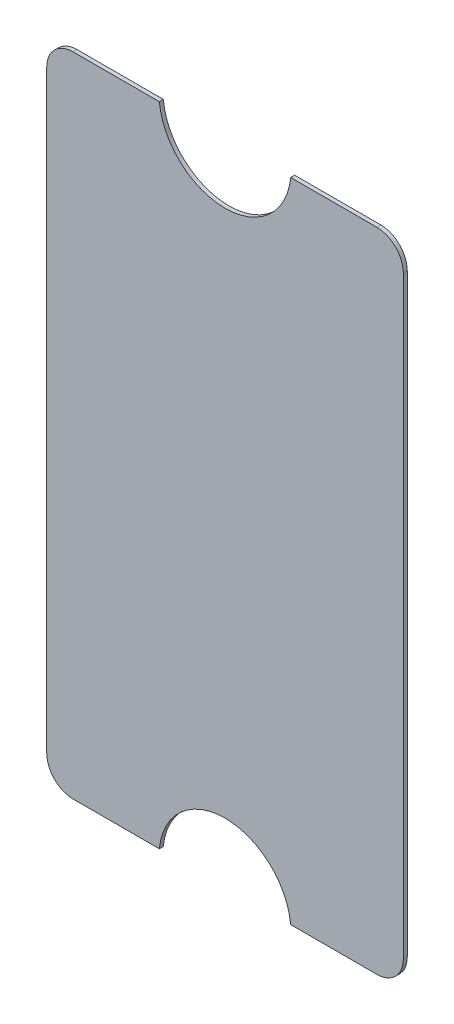
ISO-10303-21;
HEADER;
FILE_DESCRIPTION(('STEP AP214'),'2;1');
FILE_NAME('part.step','',(''),(''),'','','');
FILE_SCHEMA(('AUTOMOTIVE_DESIGN { 1 0 10303 214 1 1 1 1 }'));
ENDSEC;
DATA;
#1=APPLICATION_CONTEXT('core data for automotive mechanical design processes');
#2=APPLICATION_PROTOCOL_DEFINITION('international standard','automotive_design',2000,#1);
#3=PRODUCT_CONTEXT('',#1,'mechanical');
#4=PRODUCT('Part','Part','',(#3));
#5=PRODUCT_RELATED_PRODUCT_CATEGORY('part','',(#4));
#6=PRODUCT_DEFINITION_FORMATION('','',#4);
#7=PRODUCT_DEFINITION_CONTEXT('part definition',#1,'design');
#8=PRODUCT_DEFINITION('design','',#6,#7);
#9=PRODUCT_DEFINITION_SHAPE('','',#8);
#10=(LENGTH_UNIT() NAMED_UNIT(*) SI_UNIT(.MILLI.,.METRE.));
#11=(NAMED_UNIT(*) PLANE_ANGLE_UNIT() SI_UNIT($,.RADIAN.));
#12=(NAMED_UNIT(*) SI_UNIT($,.STERADIAN.) SOLID_ANGLE_UNIT());
#13=UNCERTAINTY_MEASURE_WITH_UNIT(LENGTH_MEASURE(1.E-05),#10,'distance_accuracy_value','');
#14=(GEOMETRIC_REPRESENTATION_CONTEXT(3) GLOBAL_UNCERTAINTY_ASSIGNED_CONTEXT((#13)) GLOBAL_UNIT_ASSIGNED_CONTEXT((#10,
#11,#12)) REPRESENTATION_CONTEXT('',''));
#15=CARTESIAN_POINT('',(0.,0.,0.));
#16=DIRECTION('',(0.,0.,1.));
#17=DIRECTION('',(1.,0.,0.));
#18=AXIS2_PLACEMENT_3D('',#15,#16,#17);
#19=CARTESIAN_POINT('',(-0.601078804943356,0.,0.3));
#20=DIRECTION('',(0.,0.,-1.));
#21=DIRECTION('',(-1.,0.,0.));
#22=AXIS2_PLACEMENT_3D('',#19,#20,#21);
#23=CYLINDRICAL_SURFACE('',#22,5.);
#24=CARTESIAN_POINT('',(-0.601078804943356,0.,0.));
#25=DIRECTION('',(0.,0.,-1.));
#26=DIRECTION('',(1.,0.,0.));
#27=AXIS2_PLACEMENT_3D('',#24,#25,#26);
#28=CIRCLE('',#27,5.);
#29=CARTESIAN_POINT('',(-5.57601599047645,0.500000000000104,0.));
#30=VERTEX_POINT('',#29);
#31=CARTESIAN_POINT('',(4.37385838058975,0.50000000000005,0.));
#32=VERTEX_POINT('',#31);
#33=EDGE_CURVE('E154',#30,#32,#28,.T.);
#34=ORIENTED_EDGE('',*,*,#33,.T.);
#35=DIRECTION('',(0.,0.,-1.));
#36=VECTOR('',#35,1.);
#37=CARTESIAN_POINT('',(4.37385838058975,0.50000000000005,0.3));
#38=LINE('',#37,#36);
#39=CARTESIAN_POINT('',(4.37385838058975,0.50000000000005,0.3));
#40=VERTEX_POINT('',#39);
#41=EDGE_CURVE('E11',#40,#32,#38,.T.);
#42=ORIENTED_EDGE('',*,*,#41,.F.);
#43=CARTESIAN_POINT('',(-0.601078804943356,0.,0.3));
#44=DIRECTION('',(0.,0.,-1.));
#45=DIRECTION('',(1.,0.,0.));
#46=AXIS2_PLACEMENT_3D('',#43,#44,#45);
#47=CIRCLE('',#46,5.);
#48=CARTESIAN_POINT('',(-5.57601599047645,0.500000000000104,0.3));
#49=VERTEX_POINT('',#48);
#50=EDGE_CURVE('E176',#49,#40,#47,.T.);
#51=ORIENTED_EDGE('',*,*,#50,.F.);
#52=DIRECTION('',(0.,0.,-1.));
#53=VECTOR('',#52,1.);
#54=CARTESIAN_POINT('',(-5.57601599047645,0.500000000000104,0.3));
#55=LINE('',#54,#53);
#56=EDGE_CURVE('E150',#49,#30,#55,.T.);
#57=ORIENTED_EDGE('',*,*,#56,.T.);
#58=EDGE_LOOP('',(#34,#42,#51,#57));
#59=FACE_BOUND('',#58,.T.);
#60=ADVANCED_FACE('F34',(#59),#23,.F.);
#61=CARTESIAN_POINT('',(4.37385838058975,0.50000000000005,0.3));
#62=DIRECTION('',(0.,1.,0.));
#63=DIRECTION('',(-1.,0.,0.));
#64=AXIS2_PLACEMENT_3D('',#61,#62,#63);
#65=PLANE('',#64);
#66=DIRECTION('',(1.,0.,0.));
#67=VECTOR('',#66,1.);
#68=CARTESIAN_POINT('',(4.37385838058975,0.50000000000005,0.));
#69=LINE('',#68,#67);
#70=CARTESIAN_POINT('',(10.8989211950564,0.500000000000014,0.));
#71=VERTEX_POINT('',#70);
#72=EDGE_CURVE('E157',#32,#71,#69,.T.);
#73=ORIENTED_EDGE('',*,*,#72,.T.);
#74=DIRECTION('',(0.,0.,-1.));
#75=VECTOR('',#74,1.);
#76=CARTESIAN_POINT('',(10.8989211950564,0.500000000000014,0.3));
#77=LINE('',#76,#75);
#78=CARTESIAN_POINT('',(10.8989211950564,0.500000000000014,0.3));
#79=VERTEX_POINT('',#78);
#80=EDGE_CURVE('E42',#79,#71,#77,.T.);
#81=ORIENTED_EDGE('',*,*,#80,.F.);
#82=DIRECTION('',(1.,0.,0.));
#83=VECTOR('',#82,1.);
#84=CARTESIAN_POINT('',(4.37385838058975,0.50000000000005,0.3));
#85=LINE('',#84,#83);
#86=EDGE_CURVE('E105',#40,#79,#85,.T.);
#87=ORIENTED_EDGE('',*,*,#86,.F.);
#88=ORIENTED_EDGE('',*,*,#41,.T.);
#89=EDGE_LOOP('',(#73,#81,#87,#88));
#90=FACE_BOUND('',#89,.T.);
#91=ADVANCED_FACE('F254',(#90),#65,.F.);
#92=CARTESIAN_POINT('',(10.8989211950564,2.50000000000001,0.3));
#93=DIRECTION('',(0.,0.,-1.));
#94=DIRECTION('',(-1.,0.,0.));
#95=AXIS2_PLACEMENT_3D('',#92,#93,#94);
#96=CYLINDRICAL_SURFACE('',#95,2.);
#97=CARTESIAN_POINT('',(10.8989211950564,2.50000000000001,0.));
#98=DIRECTION('',(0.,0.,1.));
#99=DIRECTION('',(1.,0.,0.));
#100=AXIS2_PLACEMENT_3D('',#97,#98,#99);
#101=CIRCLE('',#100,2.);
#102=CARTESIAN_POINT('',(12.8989211950564,2.50000000000001,0.));
#103=VERTEX_POINT('',#102);
#104=EDGE_CURVE('E159',#71,#103,#101,.T.);
#105=ORIENTED_EDGE('',*,*,#104,.T.);
#106=DIRECTION('',(0.,0.,-1.));
#107=VECTOR('',#106,1.);
#108=CARTESIAN_POINT('',(12.8989211950564,2.50000000000001,0.3));
#109=LINE('',#108,#107);
#110=CARTESIAN_POINT('',(12.8989211950564,2.50000000000001,0.3));
#111=VERTEX_POINT('',#110);
#112=EDGE_CURVE('E195',#111,#103,#109,.T.);
#113=ORIENTED_EDGE('',*,*,#112,.F.);
#114=CARTESIAN_POINT('',(10.8989211950564,2.50000000000001,0.3));
#115=DIRECTION('',(0.,0.,1.));
#116=DIRECTION('',(1.,0.,0.));
#117=AXIS2_PLACEMENT_3D('',#114,#115,#116);
#118=CIRCLE('',#117,2.);
#119=EDGE_CURVE('E203',#79,#111,#118,.T.);
#120=ORIENTED_EDGE('',*,*,#119,.F.);
#121=ORIENTED_EDGE('',*,*,#80,.T.);
#122=EDGE_LOOP('',(#105,#113,#120,#121));
#123=FACE_BOUND('',#122,.T.);
#124=ADVANCED_FACE('F201',(#123),#96,.T.);
#125=CARTESIAN_POINT('',(12.8989211950564,2.50000000000001,0.3));
#126=DIRECTION('',(-1.,0.,0.));
#127=DIRECTION('',(0.,-1.,0.));
#128=AXIS2_PLACEMENT_3D('',#125,#126,#127);
#129=PLANE('',#128);
#130=DIRECTION('',(0.,1.,0.));
#131=VECTOR('',#130,1.);
#132=CARTESIAN_POINT('',(12.8989211950564,2.50000000000001,0.));
#133=LINE('',#132,#131);
#134=CARTESIAN_POINT('',(12.8989211950564,47.5,0.));
#135=VERTEX_POINT('',#134);
#136=EDGE_CURVE('E161',#103,#135,#133,.T.);
#137=ORIENTED_EDGE('',*,*,#136,.T.);
#138=DIRECTION('',(0.,0.,-1.));
#139=VECTOR('',#138,1.);
#140=CARTESIAN_POINT('',(12.8989211950564,47.5,0.3));
#141=LINE('',#140,#139);
#142=CARTESIAN_POINT('',(12.8989211950564,47.5,0.3));
#143=VERTEX_POINT('',#142);
#144=EDGE_CURVE('E192',#143,#135,#141,.T.);
#145=ORIENTED_EDGE('',*,*,#144,.F.);
#146=DIRECTION('',(0.,1.,0.));
#147=VECTOR('',#146,1.);
#148=CARTESIAN_POINT('',(12.8989211950564,2.50000000000001,0.3));
#149=LINE('',#148,#147);
#150=EDGE_CURVE('E221',#111,#143,#149,.T.);
#151=ORIENTED_EDGE('',*,*,#150,.F.);
#152=ORIENTED_EDGE('',*,*,#112,.T.);
#153=EDGE_LOOP('',(#137,#145,#151,#152));
#154=FACE_BOUND('',#153,.T.);
#155=ADVANCED_FACE('F212',(#154),#129,.F.);
#156=CARTESIAN_POINT('',(10.8989211950564,47.5,0.3));
#157=DIRECTION('',(0.,0.,-1.));
#158=DIRECTION('',(-1.,0.,0.));
#159=AXIS2_PLACEMENT_3D('',#156,#157,#158);
#160=CYLINDRICAL_SURFACE('',#159,2.);
#161=CARTESIAN_POINT('',(10.8989211950564,47.5,0.));
#162=DIRECTION('',(0.,0.,1.));
#163=DIRECTION('',(1.,0.,0.));
#164=AXIS2_PLACEMENT_3D('',#161,#162,#163);
#165=CIRCLE('',#164,2.);
#166=CARTESIAN_POINT('',(10.8989211950564,49.5,0.));
#167=VERTEX_POINT('',#166);
#168=EDGE_CURVE('E163',#135,#167,#165,.T.);
#169=ORIENTED_EDGE('',*,*,#168,.T.);
#170=DIRECTION('',(0.,0.,-1.));
#171=VECTOR('',#170,1.);
#172=CARTESIAN_POINT('',(10.8989211950564,49.5,0.3));
#173=LINE('',#172,#171);
#174=CARTESIAN_POINT('',(10.8989211950564,49.5,0.3));
#175=VERTEX_POINT('',#174);
#176=EDGE_CURVE('E189',#175,#167,#173,.T.);
#177=ORIENTED_EDGE('',*,*,#176,.F.);
#178=CARTESIAN_POINT('',(10.8989211950564,47.5,0.3));
#179=DIRECTION('',(0.,0.,1.));
#180=DIRECTION('',(1.,0.,0.));
#181=AXIS2_PLACEMENT_3D('',#178,#179,#180);
#182=CIRCLE('',#181,2.);
#183=EDGE_CURVE('E218',#143,#175,#182,.T.);
#184=ORIENTED_EDGE('',*,*,#183,.F.);
#185=ORIENTED_EDGE('',*,*,#144,.T.);
#186=EDGE_LOOP('',(#169,#177,#184,#185));
#187=FACE_BOUND('',#186,.T.);
#188=ADVANCED_FACE('F216',(#187),#160,.T.);
#189=CARTESIAN_POINT('',(10.8989211950564,49.5,0.3));
#190=DIRECTION('',(0.,-1.,0.));
#191=DIRECTION('',(0.,0.,-1.));
#192=AXIS2_PLACEMENT_3D('',#189,#190,#191);
#193=PLANE('',#192);
#194=DIRECTION('',(-1.,0.,0.));
#195=VECTOR('',#194,1.);
#196=CARTESIAN_POINT('',(10.8989211950564,49.5,0.));
#197=LINE('',#196,#195);
#198=CARTESIAN_POINT('',(4.37385838058954,49.5,0.));
#199=VERTEX_POINT('',#198);
#200=EDGE_CURVE('E165',#167,#199,#197,.T.);
#201=ORIENTED_EDGE('',*,*,#200,.T.);
#202=DIRECTION('',(0.,0.,-1.));
#203=VECTOR('',#202,1.);
#204=CARTESIAN_POINT('',(4.37385838058954,49.5,0.3));
#205=LINE('',#204,#203);
#206=CARTESIAN_POINT('',(4.37385838058954,49.5,0.3));
#207=VERTEX_POINT('',#206);
#208=EDGE_CURVE('E186',#207,#199,#205,.T.);
#209=ORIENTED_EDGE('',*,*,#208,.F.);
#210=DIRECTION('',(-1.,0.,0.));
#211=VECTOR('',#210,1.);
#212=CARTESIAN_POINT('',(10.8989211950564,49.5,0.3));
#213=LINE('',#212,#211);
#214=EDGE_CURVE('E220',#175,#207,#213,.T.);
#215=ORIENTED_EDGE('',*,*,#214,.F.);
#216=ORIENTED_EDGE('',*,*,#176,.T.);
#217=EDGE_LOOP('',(#201,#209,#215,#216));
#218=FACE_BOUND('',#217,.T.);
#219=ADVANCED_FACE('F267',(#218),#193,.F.);
#220=CARTESIAN_POINT('',(-0.601078804943561,50.,0.3));
#221=DIRECTION('',(0.,0.,-1.));
#222=DIRECTION('',(-1.,0.,0.));
#223=AXIS2_PLACEMENT_3D('',#220,#221,#222);
#224=CYLINDRICAL_SURFACE('',#223,5.);
#225=CARTESIAN_POINT('',(-0.601078804943561,50.,0.));
#226=DIRECTION('',(0.,0.,-1.));
#227=DIRECTION('',(1.,0.,0.));
#228=AXIS2_PLACEMENT_3D('',#225,#226,#227);
#229=CIRCLE('',#228,5.);
#230=CARTESIAN_POINT('',(-5.57601599047666,49.5,0.));
#231=VERTEX_POINT('',#230);
#232=EDGE_CURVE('E167',#199,#231,#229,.T.);
#233=ORIENTED_EDGE('',*,*,#232,.T.);
#234=DIRECTION('',(0.,0.,-1.));
#235=VECTOR('',#234,1.);
#236=CARTESIAN_POINT('',(-5.57601599047666,49.5,0.3));
#237=LINE('',#236,#235);
#238=CARTESIAN_POINT('',(-5.57601599047666,49.5,0.3));
#239=VERTEX_POINT('',#238);
#240=EDGE_CURVE('E183',#239,#231,#237,.T.);
#241=ORIENTED_EDGE('',*,*,#240,.F.);
#242=CARTESIAN_POINT('',(-0.601078804943561,50.,0.3));
#243=DIRECTION('',(0.,0.,-1.));
#244=DIRECTION('',(1.,0.,0.));
#245=AXIS2_PLACEMENT_3D('',#242,#243,#244);
#246=CIRCLE('',#245,5.);
#247=EDGE_CURVE('E223',#207,#239,#246,.T.);
#248=ORIENTED_EDGE('',*,*,#247,.F.);
#249=ORIENTED_EDGE('',*,*,#208,.T.);
#250=EDGE_LOOP('',(#233,#241,#248,#249));
#251=FACE_BOUND('',#250,.T.);
#252=ADVANCED_FACE('F270',(#251),#224,.F.);
#253=CARTESIAN_POINT('',(-5.57601599047666,49.5,0.3));
#254=DIRECTION('',(0.,-1.,0.));
#255=DIRECTION('',(0.,0.,-1.));
#256=AXIS2_PLACEMENT_3D('',#253,#254,#255);
#257=PLANE('',#256);
#258=DIRECTION('',(-1.,0.,0.));
#259=VECTOR('',#258,1.);
#260=CARTESIAN_POINT('',(-5.57601599047666,49.5,0.));
#261=LINE('',#260,#259);
#262=CARTESIAN_POINT('',(-12.1010788049435,49.5,0.));
#263=VERTEX_POINT('',#262);
#264=EDGE_CURVE('E169',#231,#263,#261,.T.);
#265=ORIENTED_EDGE('',*,*,#264,.T.);
#266=DIRECTION('',(0.,0.,-1.));
#267=VECTOR('',#266,1.);
#268=CARTESIAN_POINT('',(-12.1010788049435,49.5,0.3));
#269=LINE('',#268,#267);
#270=CARTESIAN_POINT('',(-12.1010788049435,49.5,0.3));
#271=VERTEX_POINT('',#270);
#272=EDGE_CURVE('E180',#271,#263,#269,.T.);
#273=ORIENTED_EDGE('',*,*,#272,.F.);
#274=DIRECTION('',(-1.,0.,0.));
#275=VECTOR('',#274,1.);
#276=CARTESIAN_POINT('',(-5.57601599047666,49.5,0.3));
#277=LINE('',#276,#275);
#278=EDGE_CURVE('E229',#239,#271,#277,.T.);
#279=ORIENTED_EDGE('',*,*,#278,.F.);
#280=ORIENTED_EDGE('',*,*,#240,.T.);
#281=EDGE_LOOP('',(#265,#273,#279,#280));
#282=FACE_BOUND('',#281,.T.);
#283=ADVANCED_FACE('F235',(#282),#257,.F.);
#284=CARTESIAN_POINT('',(-12.1010788049435,47.5,0.3));
#285=DIRECTION('',(0.,0.,-1.));
#286=DIRECTION('',(-1.,0.,0.));
#287=AXIS2_PLACEMENT_3D('',#284,#285,#286);
#288=CYLINDRICAL_SURFACE('',#287,2.);
#289=CARTESIAN_POINT('',(-12.1010788049435,47.5,0.));
#290=DIRECTION('',(0.,0.,1.));
#291=DIRECTION('',(1.,0.,0.));
#292=AXIS2_PLACEMENT_3D('',#289,#290,#291);
#293=CIRCLE('',#292,2.);
#294=CARTESIAN_POINT('',(-14.1010788049435,47.5,0.));
#295=VERTEX_POINT('',#294);
#296=EDGE_CURVE('E171',#263,#295,#293,.T.);
#297=ORIENTED_EDGE('',*,*,#296,.T.);
#298=DIRECTION('',(0.,0.,-1.));
#299=VECTOR('',#298,1.);
#300=CARTESIAN_POINT('',(-14.1010788049435,47.5,0.3));
#301=LINE('',#300,#299);
#302=CARTESIAN_POINT('',(-14.1010788049435,47.5,0.3));
#303=VERTEX_POINT('',#302);
#304=EDGE_CURVE('E145',#303,#295,#301,.T.);
#305=ORIENTED_EDGE('',*,*,#304,.F.);
#306=CARTESIAN_POINT('',(-12.1010788049435,47.5,0.3));
#307=DIRECTION('',(0.,0.,1.));
#308=DIRECTION('',(1.,0.,0.));
#309=AXIS2_PLACEMENT_3D('',#306,#307,#308);
#310=CIRCLE('',#309,2.);
#311=EDGE_CURVE('E136',#271,#303,#310,.T.);
#312=ORIENTED_EDGE('',*,*,#311,.F.);
#313=ORIENTED_EDGE('',*,*,#272,.T.);
#314=EDGE_LOOP('',(#297,#305,#312,#313));
#315=FACE_BOUND('',#314,.T.);
#316=ADVANCED_FACE('F239',(#315),#288,.T.);
#317=CARTESIAN_POINT('',(-14.1010788049435,47.5,0.3));
#318=DIRECTION('',(1.,0.,0.));
#319=DIRECTION('',(0.,1.,0.));
#320=AXIS2_PLACEMENT_3D('',#317,#318,#319);
#321=PLANE('',#320);
#322=DIRECTION('',(0.,-1.,0.));
#323=VECTOR('',#322,1.);
#324=CARTESIAN_POINT('',(-14.1010788049435,47.5,0.));
#325=LINE('',#324,#323);
#326=CARTESIAN_POINT('',(-14.1010788049432,2.50000000000012,0.));
#327=VERTEX_POINT('',#326);
#328=EDGE_CURVE('E144',#295,#327,#325,.T.);
#329=ORIENTED_EDGE('',*,*,#328,.T.);
#330=DIRECTION('',(0.,0.,-1.));
#331=VECTOR('',#330,1.);
#332=CARTESIAN_POINT('',(-14.1010788049432,2.50000000000012,0.3));
#333=LINE('',#332,#331);
#334=CARTESIAN_POINT('',(-14.1010788049432,2.50000000000012,0.3));
#335=VERTEX_POINT('',#334);
#336=EDGE_CURVE('E141',#335,#327,#333,.T.);
#337=ORIENTED_EDGE('',*,*,#336,.F.);
#338=DIRECTION('',(0.,-1.,0.));
#339=VECTOR('',#338,1.);
#340=CARTESIAN_POINT('',(-14.1010788049435,47.5,0.3));
#341=LINE('',#340,#339);
#342=EDGE_CURVE('E130',#303,#335,#341,.T.);
#343=ORIENTED_EDGE('',*,*,#342,.F.);
#344=ORIENTED_EDGE('',*,*,#304,.T.);
#345=EDGE_LOOP('',(#329,#337,#343,#344));
#346=FACE_BOUND('',#345,.T.);
#347=ADVANCED_FACE('F142',(#346),#321,.F.);
#348=CARTESIAN_POINT('',(-12.1010788049432,2.50000000000014,0.3));
#349=DIRECTION('',(0.,0.,-1.));
#350=DIRECTION('',(-1.,0.,0.));
#351=AXIS2_PLACEMENT_3D('',#348,#349,#350);
#352=CYLINDRICAL_SURFACE('',#351,2.);
#353=CARTESIAN_POINT('',(-12.1010788049432,2.50000000000014,0.));
#354=DIRECTION('',(0.,0.,1.));
#355=DIRECTION('',(1.,0.,0.));
#356=AXIS2_PLACEMENT_3D('',#353,#354,#355);
#357=CIRCLE('',#356,2.);
#358=CARTESIAN_POINT('',(-12.1010788049432,0.500000000000139,0.));
#359=VERTEX_POINT('',#358);
#360=EDGE_CURVE('E91',#327,#359,#357,.T.);
#361=ORIENTED_EDGE('',*,*,#360,.T.);
#362=DIRECTION('',(0.,0.,-1.));
#363=VECTOR('',#362,1.);
#364=CARTESIAN_POINT('',(-12.1010788049432,0.500000000000139,0.3));
#365=LINE('',#364,#363);
#366=CARTESIAN_POINT('',(-12.1010788049432,0.500000000000139,0.3));
#367=VERTEX_POINT('',#366);
#368=EDGE_CURVE('E146',#367,#359,#365,.T.);
#369=ORIENTED_EDGE('',*,*,#368,.F.);
#370=CARTESIAN_POINT('',(-12.1010788049432,2.50000000000014,0.3));
#371=DIRECTION('',(0.,0.,1.));
#372=DIRECTION('',(1.,0.,0.));
#373=AXIS2_PLACEMENT_3D('',#370,#371,#372);
#374=CIRCLE('',#373,2.);
#375=EDGE_CURVE('E134',#335,#367,#374,.T.);
#376=ORIENTED_EDGE('',*,*,#375,.F.);
#377=ORIENTED_EDGE('',*,*,#336,.T.);
#378=EDGE_LOOP('',(#361,#369,#376,#377));
#379=FACE_BOUND('',#378,.T.);
#380=ADVANCED_FACE('F148',(#379),#352,.T.);
#381=CARTESIAN_POINT('',(-12.1010788049432,0.500000000000139,0.3));
#382=DIRECTION('',(0.,1.,0.));
#383=DIRECTION('',(-1.,0.,0.));
#384=AXIS2_PLACEMENT_3D('',#381,#382,#383);
#385=PLANE('',#384);
#386=DIRECTION('',(1.,0.,0.));
#387=VECTOR('',#386,1.);
#388=CARTESIAN_POINT('',(-12.1010788049432,0.500000000000139,0.));
#389=LINE('',#388,#387);
#390=EDGE_CURVE('E97',#359,#30,#389,.T.);
#391=ORIENTED_EDGE('',*,*,#390,.T.);
#392=ORIENTED_EDGE('',*,*,#56,.F.);
#393=DIRECTION('',(1.,0.,0.));
#394=VECTOR('',#393,1.);
#395=CARTESIAN_POINT('',(-12.1010788049432,0.500000000000139,0.3));
#396=LINE('',#395,#394);
#397=EDGE_CURVE('E50',#367,#49,#396,.T.);
#398=ORIENTED_EDGE('',*,*,#397,.F.);
#399=ORIENTED_EDGE('',*,*,#368,.T.);
#400=EDGE_LOOP('',(#391,#392,#398,#399));
#401=FACE_BOUND('',#400,.T.);
#402=ADVANCED_FACE('F243',(#401),#385,.F.);
#403=CARTESIAN_POINT('',(-0.601078804943356,0.,0.3));
#404=DIRECTION('',(0.,0.,1.));
#405=DIRECTION('',(1.,0.,0.));
#406=AXIS2_PLACEMENT_3D('',#403,#404,#405);
#407=PLANE('',#406);
#408=ORIENTED_EDGE('',*,*,#50,.T.);
#409=ORIENTED_EDGE('',*,*,#86,.T.);
#410=ORIENTED_EDGE('',*,*,#119,.T.);
#411=ORIENTED_EDGE('',*,*,#150,.T.);
#412=ORIENTED_EDGE('',*,*,#183,.T.);
#413=ORIENTED_EDGE('',*,*,#214,.T.);
#414=ORIENTED_EDGE('',*,*,#247,.T.);
#415=ORIENTED_EDGE('',*,*,#278,.T.);
#416=ORIENTED_EDGE('',*,*,#311,.T.);
#417=ORIENTED_EDGE('',*,*,#342,.T.);
#418=ORIENTED_EDGE('',*,*,#375,.T.);
#419=ORIENTED_EDGE('',*,*,#397,.T.);
#420=EDGE_LOOP('',(#408,#409,#410,#411,#412,#413,#414,#415,#416,#417,#418,#419));
#421=FACE_BOUND('',#420,.T.);
#422=ADVANCED_FACE('F132',(#421),#407,.T.);
#423=CARTESIAN_POINT('',(-0.601078804943356,0.,0.));
#424=DIRECTION('',(0.,0.,1.));
#425=DIRECTION('',(1.,0.,0.));
#426=AXIS2_PLACEMENT_3D('',#423,#424,#425);
#427=PLANE('',#426);
#428=ORIENTED_EDGE('',*,*,#33,.F.);
#429=ORIENTED_EDGE('',*,*,#390,.F.);
#430=ORIENTED_EDGE('',*,*,#360,.F.);
#431=ORIENTED_EDGE('',*,*,#328,.F.);
#432=ORIENTED_EDGE('',*,*,#296,.F.);
#433=ORIENTED_EDGE('',*,*,#264,.F.);
#434=ORIENTED_EDGE('',*,*,#232,.F.);
#435=ORIENTED_EDGE('',*,*,#200,.F.);
#436=ORIENTED_EDGE('',*,*,#168,.F.);
#437=ORIENTED_EDGE('',*,*,#136,.F.);
#438=ORIENTED_EDGE('',*,*,#104,.F.);
#439=ORIENTED_EDGE('',*,*,#72,.F.);
#440=EDGE_LOOP('',(#428,#429,#430,#431,#432,#433,#434,#435,#436,#437,#438,#439));
#441=FACE_BOUND('',#440,.T.);
#442=ADVANCED_FACE('F207',(#441),#427,.F.);
#443=CLOSED_SHELL('',(#60,#91,#124,#155,#188,#219,#252,#283,#316,#347,#380,#402,#422,#442));
#444=MANIFOLD_SOLID_BREP('B2',#443);
#445=ADVANCED_BREP_SHAPE_REPRESENTATION('',(#18,#444),#14);
#446=SHAPE_DEFINITION_REPRESENTATION(#9,#445);
ENDSEC;
END-ISO-10303-21;
